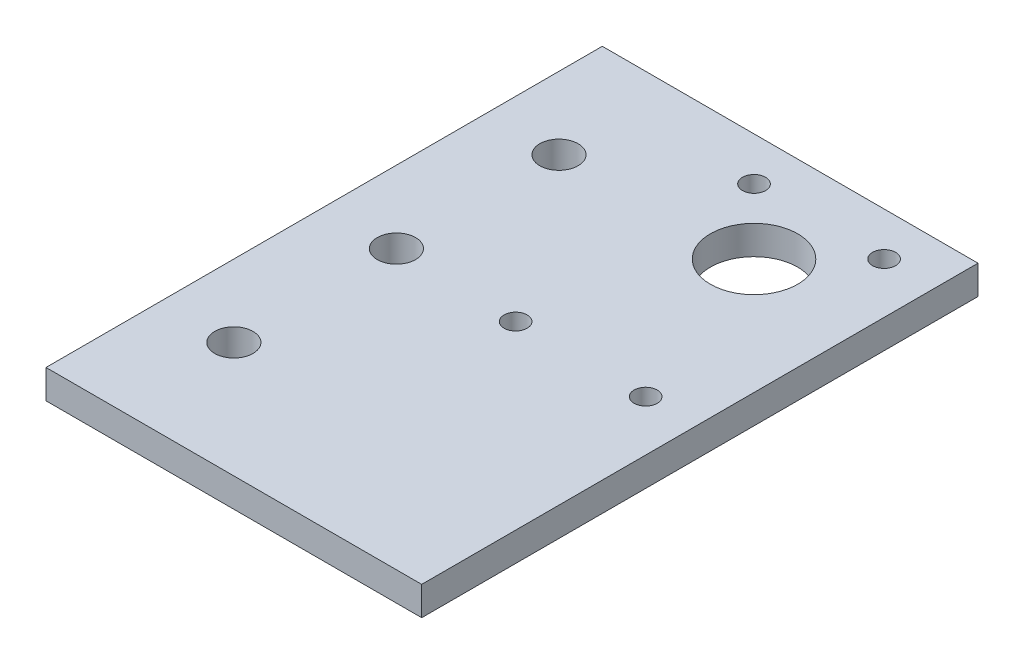
ISO-10303-21;
HEADER;
FILE_DESCRIPTION(('STEP AP214'),'2;1');
FILE_NAME('part.step','',(''),(''),'','','');
FILE_SCHEMA(('AUTOMOTIVE_DESIGN { 1 0 10303 214 1 1 1 1 }'));
ENDSEC;
DATA;
#1=APPLICATION_CONTEXT('core data for automotive mechanical design processes');
#2=APPLICATION_PROTOCOL_DEFINITION('international standard','automotive_design',2000,#1);
#3=PRODUCT_CONTEXT('',#1,'mechanical');
#4=PRODUCT('Part','Part','',(#3));
#5=PRODUCT_RELATED_PRODUCT_CATEGORY('part','',(#4));
#6=PRODUCT_DEFINITION_FORMATION('','',#4);
#7=PRODUCT_DEFINITION_CONTEXT('part definition',#1,'design');
#8=PRODUCT_DEFINITION('design','',#6,#7);
#9=PRODUCT_DEFINITION_SHAPE('','',#8);
#10=(LENGTH_UNIT() NAMED_UNIT(*) SI_UNIT(.MILLI.,.METRE.));
#11=(NAMED_UNIT(*) PLANE_ANGLE_UNIT() SI_UNIT($,.RADIAN.));
#12=(NAMED_UNIT(*) SI_UNIT($,.STERADIAN.) SOLID_ANGLE_UNIT());
#13=UNCERTAINTY_MEASURE_WITH_UNIT(LENGTH_MEASURE(1.E-05),#10,'distance_accuracy_value','');
#14=(GEOMETRIC_REPRESENTATION_CONTEXT(3) GLOBAL_UNCERTAINTY_ASSIGNED_CONTEXT((#13)) GLOBAL_UNIT_ASSIGNED_CONTEXT((#10,
#11,#12)) REPRESENTATION_CONTEXT('',''));
#15=CARTESIAN_POINT('',(0.,0.,0.));
#16=DIRECTION('',(0.,0.,1.));
#17=DIRECTION('',(1.,0.,0.));
#18=AXIS2_PLACEMENT_3D('',#15,#16,#17);
#19=CARTESIAN_POINT('',(52.,4.,0.));
#20=DIRECTION('',(1.,0.,0.));
#21=DIRECTION('',(0.,0.,-1.));
#22=AXIS2_PLACEMENT_3D('',#19,#20,#21);
#23=PLANE('',#22);
#24=DIRECTION('',(0.,0.,1.));
#25=VECTOR('',#24,1.);
#26=CARTESIAN_POINT('',(52.,0.,0.));
#27=LINE('',#26,#25);
#28=CARTESIAN_POINT('',(52.,0.,0.));
#29=VERTEX_POINT('',#28);
#30=CARTESIAN_POINT('',(52.,0.,77.));
#31=VERTEX_POINT('',#30);
#32=EDGE_CURVE('E147',#29,#31,#27,.T.);
#33=ORIENTED_EDGE('',*,*,#32,.F.);
#34=DIRECTION('',(0.,-1.,0.));
#35=VECTOR('',#34,1.);
#36=CARTESIAN_POINT('',(52.,4.,0.));
#37=LINE('',#36,#35);
#38=CARTESIAN_POINT('',(52.,4.,0.));
#39=VERTEX_POINT('',#38);
#40=EDGE_CURVE('E11',#39,#29,#37,.T.);
#41=ORIENTED_EDGE('',*,*,#40,.F.);
#42=DIRECTION('',(0.,0.,1.));
#43=VECTOR('',#42,1.);
#44=CARTESIAN_POINT('',(52.,4.,0.));
#45=LINE('',#44,#43);
#46=CARTESIAN_POINT('',(52.,4.,77.));
#47=VERTEX_POINT('',#46);
#48=EDGE_CURVE('E105',#39,#47,#45,.T.);
#49=ORIENTED_EDGE('',*,*,#48,.T.);
#50=DIRECTION('',(0.,-1.,0.));
#51=VECTOR('',#50,1.);
#52=CARTESIAN_POINT('',(52.,4.,77.));
#53=LINE('',#52,#51);
#54=EDGE_CURVE('E82',#47,#31,#53,.T.);
#55=ORIENTED_EDGE('',*,*,#54,.T.);
#56=EDGE_LOOP('',(#33,#41,#49,#55));
#57=FACE_BOUND('',#56,.T.);
#58=ADVANCED_FACE('F41',(#57),#23,.T.);
#59=CARTESIAN_POINT('',(0.,4.,0.));
#60=DIRECTION('',(0.,0.,-1.));
#61=DIRECTION('',(-1.,0.,0.));
#62=AXIS2_PLACEMENT_3D('',#59,#60,#61);
#63=PLANE('',#62);
#64=DIRECTION('',(1.,0.,0.));
#65=VECTOR('',#64,1.);
#66=CARTESIAN_POINT('',(0.,0.,0.));
#67=LINE('',#66,#65);
#68=CARTESIAN_POINT('',(0.,0.,0.));
#69=VERTEX_POINT('',#68);
#70=EDGE_CURVE('E94',#69,#29,#67,.T.);
#71=ORIENTED_EDGE('',*,*,#70,.F.);
#72=DIRECTION('',(0.,-1.,0.));
#73=VECTOR('',#72,1.);
#74=CARTESIAN_POINT('',(0.,4.,0.));
#75=LINE('',#74,#73);
#76=CARTESIAN_POINT('',(0.,4.,0.));
#77=VERTEX_POINT('',#76);
#78=EDGE_CURVE('E51',#77,#69,#75,.T.);
#79=ORIENTED_EDGE('',*,*,#78,.F.);
#80=DIRECTION('',(1.,0.,0.));
#81=VECTOR('',#80,1.);
#82=CARTESIAN_POINT('',(0.,4.,0.));
#83=LINE('',#82,#81);
#84=EDGE_CURVE('E92',#77,#39,#83,.T.);
#85=ORIENTED_EDGE('',*,*,#84,.T.);
#86=ORIENTED_EDGE('',*,*,#40,.T.);
#87=EDGE_LOOP('',(#71,#79,#85,#86));
#88=FACE_BOUND('',#87,.T.);
#89=ADVANCED_FACE('F90',(#88),#63,.T.);
#90=CARTESIAN_POINT('',(0.,4.,0.));
#91=DIRECTION('',(1.,0.,0.));
#92=DIRECTION('',(0.,0.,-1.));
#93=AXIS2_PLACEMENT_3D('',#90,#91,#92);
#94=PLANE('',#93);
#95=DIRECTION('',(0.,0.,1.));
#96=VECTOR('',#95,1.);
#97=CARTESIAN_POINT('',(0.,0.,0.));
#98=LINE('',#97,#96);
#99=CARTESIAN_POINT('',(0.,0.,77.));
#100=VERTEX_POINT('',#99);
#101=EDGE_CURVE('E152',#69,#100,#98,.T.);
#102=ORIENTED_EDGE('',*,*,#101,.T.);
#103=DIRECTION('',(0.,-1.,0.));
#104=VECTOR('',#103,1.);
#105=CARTESIAN_POINT('',(0.,4.,77.));
#106=LINE('',#105,#104);
#107=CARTESIAN_POINT('',(0.,4.,77.));
#108=VERTEX_POINT('',#107);
#109=EDGE_CURVE('E98',#108,#100,#106,.T.);
#110=ORIENTED_EDGE('',*,*,#109,.F.);
#111=DIRECTION('',(0.,0.,1.));
#112=VECTOR('',#111,1.);
#113=CARTESIAN_POINT('',(0.,4.,0.));
#114=LINE('',#113,#112);
#115=EDGE_CURVE('E100',#77,#108,#114,.T.);
#116=ORIENTED_EDGE('',*,*,#115,.F.);
#117=ORIENTED_EDGE('',*,*,#78,.T.);
#118=EDGE_LOOP('',(#102,#110,#116,#117));
#119=FACE_BOUND('',#118,.T.);
#120=ADVANCED_FACE('F101',(#119),#94,.F.);
#121=CARTESIAN_POINT('',(27.,4.,6.));
#122=DIRECTION('',(0.,-1.,0.));
#123=DIRECTION('',(0.,0.,-1.));
#124=AXIS2_PLACEMENT_3D('',#121,#122,#123);
#125=CYLINDRICAL_SURFACE('',#124,1.6);
#126=CARTESIAN_POINT('',(27.,4.,6.));
#127=DIRECTION('',(0.,1.,0.));
#128=DIRECTION('',(0.,0.,1.));
#129=AXIS2_PLACEMENT_3D('',#126,#127,#128);
#130=CIRCLE('',#129,1.6);
#131=CARTESIAN_POINT('',(27.,4.,7.6));
#132=VERTEX_POINT('',#131);
#133=EDGE_CURVE('E109',#132,#132,#130,.T.);
#134=ORIENTED_EDGE('',*,*,#133,.T.);
#135=EDGE_LOOP('',(#134));
#136=FACE_BOUND('',#135,.T.);
#137=CARTESIAN_POINT('',(27.,0.,6.));
#138=DIRECTION('',(0.,1.,0.));
#139=DIRECTION('',(0.,0.,1.));
#140=AXIS2_PLACEMENT_3D('',#137,#138,#139);
#141=CIRCLE('',#140,1.6);
#142=CARTESIAN_POINT('',(27.,0.,7.6));
#143=VERTEX_POINT('',#142);
#144=EDGE_CURVE('E143',#143,#143,#141,.T.);
#145=ORIENTED_EDGE('',*,*,#144,.F.);
#146=EDGE_LOOP('',(#145));
#147=FACE_BOUND('',#146,.T.);
#148=ADVANCED_FACE('F172',(#136,#147),#125,.F.);
#149=CARTESIAN_POINT('',(45.,4.,6.));
#150=DIRECTION('',(0.,-1.,0.));
#151=DIRECTION('',(0.,0.,-1.));
#152=AXIS2_PLACEMENT_3D('',#149,#150,#151);
#153=CYLINDRICAL_SURFACE('',#152,1.6);
#154=CARTESIAN_POINT('',(45.,4.,6.));
#155=DIRECTION('',(0.,1.,0.));
#156=DIRECTION('',(0.,0.,1.));
#157=AXIS2_PLACEMENT_3D('',#154,#155,#156);
#158=CIRCLE('',#157,1.6);
#159=CARTESIAN_POINT('',(45.,4.,7.6));
#160=VERTEX_POINT('',#159);
#161=EDGE_CURVE('E340',#160,#160,#158,.T.);
#162=ORIENTED_EDGE('',*,*,#161,.T.);
#163=EDGE_LOOP('',(#162));
#164=FACE_BOUND('',#163,.T.);
#165=CARTESIAN_POINT('',(45.,0.,6.));
#166=DIRECTION('',(0.,1.,0.));
#167=DIRECTION('',(0.,0.,1.));
#168=AXIS2_PLACEMENT_3D('',#165,#166,#167);
#169=CIRCLE('',#168,1.6);
#170=CARTESIAN_POINT('',(45.,0.,7.6));
#171=VERTEX_POINT('',#170);
#172=EDGE_CURVE('E139',#171,#171,#169,.T.);
#173=ORIENTED_EDGE('',*,*,#172,.F.);
#174=EDGE_LOOP('',(#173));
#175=FACE_BOUND('',#174,.T.);
#176=ADVANCED_FACE('F175',(#164,#175),#153,.F.);
#177=CARTESIAN_POINT('',(45.,4.,39.));
#178=DIRECTION('',(0.,-1.,0.));
#179=DIRECTION('',(0.,0.,-1.));
#180=AXIS2_PLACEMENT_3D('',#177,#178,#179);
#181=CYLINDRICAL_SURFACE('',#180,1.6);
#182=CARTESIAN_POINT('',(45.,4.,39.));
#183=DIRECTION('',(0.,1.,0.));
#184=DIRECTION('',(0.,0.,1.));
#185=AXIS2_PLACEMENT_3D('',#182,#183,#184);
#186=CIRCLE('',#185,1.6);
#187=CARTESIAN_POINT('',(45.,4.,40.6));
#188=VERTEX_POINT('',#187);
#189=EDGE_CURVE('E336',#188,#188,#186,.T.);
#190=ORIENTED_EDGE('',*,*,#189,.T.);
#191=EDGE_LOOP('',(#190));
#192=FACE_BOUND('',#191,.T.);
#193=CARTESIAN_POINT('',(45.,0.,39.));
#194=DIRECTION('',(0.,1.,0.));
#195=DIRECTION('',(0.,0.,1.));
#196=AXIS2_PLACEMENT_3D('',#193,#194,#195);
#197=CIRCLE('',#196,1.6);
#198=CARTESIAN_POINT('',(45.,0.,40.6));
#199=VERTEX_POINT('',#198);
#200=EDGE_CURVE('E135',#199,#199,#197,.T.);
#201=ORIENTED_EDGE('',*,*,#200,.F.);
#202=EDGE_LOOP('',(#201));
#203=FACE_BOUND('',#202,.T.);
#204=ADVANCED_FACE('F179',(#192,#203),#181,.F.);
#205=CARTESIAN_POINT('',(27.,4.,39.));
#206=DIRECTION('',(0.,-1.,0.));
#207=DIRECTION('',(0.,0.,-1.));
#208=AXIS2_PLACEMENT_3D('',#205,#206,#207);
#209=CYLINDRICAL_SURFACE('',#208,1.6);
#210=CARTESIAN_POINT('',(27.,4.,39.));
#211=DIRECTION('',(0.,1.,0.));
#212=DIRECTION('',(0.,0.,1.));
#213=AXIS2_PLACEMENT_3D('',#210,#211,#212);
#214=CIRCLE('',#213,1.6);
#215=CARTESIAN_POINT('',(27.,4.,40.6));
#216=VERTEX_POINT('',#215);
#217=EDGE_CURVE('E332',#216,#216,#214,.T.);
#218=ORIENTED_EDGE('',*,*,#217,.T.);
#219=EDGE_LOOP('',(#218));
#220=FACE_BOUND('',#219,.T.);
#221=CARTESIAN_POINT('',(27.,0.,39.));
#222=DIRECTION('',(0.,1.,0.));
#223=DIRECTION('',(0.,0.,1.));
#224=AXIS2_PLACEMENT_3D('',#221,#222,#223);
#225=CIRCLE('',#224,1.6);
#226=CARTESIAN_POINT('',(27.,0.,40.6));
#227=VERTEX_POINT('',#226);
#228=EDGE_CURVE('E131',#227,#227,#225,.T.);
#229=ORIENTED_EDGE('',*,*,#228,.F.);
#230=EDGE_LOOP('',(#229));
#231=FACE_BOUND('',#230,.T.);
#232=ADVANCED_FACE('F183',(#220,#231),#209,.F.);
#233=CARTESIAN_POINT('',(9.99999999999999,4.,16.));
#234=DIRECTION('',(0.,-1.,0.));
#235=DIRECTION('',(0.,0.,-1.));
#236=AXIS2_PLACEMENT_3D('',#233,#234,#235);
#237=CYLINDRICAL_SURFACE('',#236,2.65);
#238=CARTESIAN_POINT('',(9.99999999999999,4.,16.));
#239=DIRECTION('',(0.,1.,0.));
#240=DIRECTION('',(0.,0.,1.));
#241=AXIS2_PLACEMENT_3D('',#238,#239,#240);
#242=CIRCLE('',#241,2.65);
#243=CARTESIAN_POINT('',(9.99999999999999,4.,18.65));
#244=VERTEX_POINT('',#243);
#245=EDGE_CURVE('E328',#244,#244,#242,.T.);
#246=ORIENTED_EDGE('',*,*,#245,.T.);
#247=EDGE_LOOP('',(#246));
#248=FACE_BOUND('',#247,.T.);
#249=CARTESIAN_POINT('',(9.99999999999999,0.,16.));
#250=DIRECTION('',(0.,1.,0.));
#251=DIRECTION('',(0.,0.,1.));
#252=AXIS2_PLACEMENT_3D('',#249,#250,#251);
#253=CIRCLE('',#252,2.65);
#254=CARTESIAN_POINT('',(9.99999999999999,0.,18.65));
#255=VERTEX_POINT('',#254);
#256=EDGE_CURVE('E127',#255,#255,#253,.T.);
#257=ORIENTED_EDGE('',*,*,#256,.F.);
#258=EDGE_LOOP('',(#257));
#259=FACE_BOUND('',#258,.T.);
#260=ADVANCED_FACE('F187',(#248,#259),#237,.F.);
#261=CARTESIAN_POINT('',(36.,4.,15.));
#262=DIRECTION('',(0.,-1.,0.));
#263=DIRECTION('',(0.,0.,-1.));
#264=AXIS2_PLACEMENT_3D('',#261,#262,#263);
#265=CYLINDRICAL_SURFACE('',#264,6.05);
#266=CARTESIAN_POINT('',(36.,4.,15.));
#267=DIRECTION('',(0.,1.,0.));
#268=DIRECTION('',(0.,0.,1.));
#269=AXIS2_PLACEMENT_3D('',#266,#267,#268);
#270=CIRCLE('',#269,6.05);
#271=CARTESIAN_POINT('',(36.,4.,21.05));
#272=VERTEX_POINT('',#271);
#273=EDGE_CURVE('E324',#272,#272,#270,.T.);
#274=ORIENTED_EDGE('',*,*,#273,.T.);
#275=EDGE_LOOP('',(#274));
#276=FACE_BOUND('',#275,.T.);
#277=CARTESIAN_POINT('',(36.,0.,15.));
#278=DIRECTION('',(0.,1.,0.));
#279=DIRECTION('',(0.,0.,1.));
#280=AXIS2_PLACEMENT_3D('',#277,#278,#279);
#281=CIRCLE('',#280,6.05);
#282=CARTESIAN_POINT('',(36.,0.,21.05));
#283=VERTEX_POINT('',#282);
#284=EDGE_CURVE('E123',#283,#283,#281,.T.);
#285=ORIENTED_EDGE('',*,*,#284,.F.);
#286=EDGE_LOOP('',(#285));
#287=FACE_BOUND('',#286,.T.);
#288=ADVANCED_FACE('F191',(#276,#287),#265,.F.);
#289=CARTESIAN_POINT('',(10.,4.,38.5));
#290=DIRECTION('',(0.,-1.,0.));
#291=DIRECTION('',(0.,0.,-1.));
#292=AXIS2_PLACEMENT_3D('',#289,#290,#291);
#293=CYLINDRICAL_SURFACE('',#292,2.65);
#294=CARTESIAN_POINT('',(10.,4.,38.5));
#295=DIRECTION('',(0.,1.,0.));
#296=DIRECTION('',(0.,0.,1.));
#297=AXIS2_PLACEMENT_3D('',#294,#295,#296);
#298=CIRCLE('',#297,2.65);
#299=CARTESIAN_POINT('',(10.,4.,41.15));
#300=VERTEX_POINT('',#299);
#301=EDGE_CURVE('E205',#300,#300,#298,.T.);
#302=ORIENTED_EDGE('',*,*,#301,.T.);
#303=EDGE_LOOP('',(#302));
#304=FACE_BOUND('',#303,.T.);
#305=CARTESIAN_POINT('',(10.,0.,38.5));
#306=DIRECTION('',(0.,1.,0.));
#307=DIRECTION('',(0.,0.,1.));
#308=AXIS2_PLACEMENT_3D('',#305,#306,#307);
#309=CIRCLE('',#308,2.65);
#310=CARTESIAN_POINT('',(10.,0.,41.15));
#311=VERTEX_POINT('',#310);
#312=EDGE_CURVE('E119',#311,#311,#309,.T.);
#313=ORIENTED_EDGE('',*,*,#312,.F.);
#314=EDGE_LOOP('',(#313));
#315=FACE_BOUND('',#314,.T.);
#316=ADVANCED_FACE('F194',(#304,#315),#293,.F.);
#317=CARTESIAN_POINT('',(10.,4.,61.));
#318=DIRECTION('',(0.,-1.,0.));
#319=DIRECTION('',(0.,0.,-1.));
#320=AXIS2_PLACEMENT_3D('',#317,#318,#319);
#321=CYLINDRICAL_SURFACE('',#320,2.65);
#322=CARTESIAN_POINT('',(10.,4.,61.));
#323=DIRECTION('',(0.,1.,0.));
#324=DIRECTION('',(0.,0.,1.));
#325=AXIS2_PLACEMENT_3D('',#322,#323,#324);
#326=CIRCLE('',#325,2.65);
#327=CARTESIAN_POINT('',(10.,4.,63.65));
#328=VERTEX_POINT('',#327);
#329=EDGE_CURVE('E157',#328,#328,#326,.T.);
#330=ORIENTED_EDGE('',*,*,#329,.T.);
#331=EDGE_LOOP('',(#330));
#332=FACE_BOUND('',#331,.T.);
#333=CARTESIAN_POINT('',(10.,0.,61.));
#334=DIRECTION('',(0.,1.,0.));
#335=DIRECTION('',(0.,0.,1.));
#336=AXIS2_PLACEMENT_3D('',#333,#334,#335);
#337=CIRCLE('',#336,2.65);
#338=CARTESIAN_POINT('',(10.,0.,63.65));
#339=VERTEX_POINT('',#338);
#340=EDGE_CURVE('E115',#339,#339,#337,.T.);
#341=ORIENTED_EDGE('',*,*,#340,.F.);
#342=EDGE_LOOP('',(#341));
#343=FACE_BOUND('',#342,.T.);
#344=ADVANCED_FACE('F43',(#332,#343),#321,.F.);
#345=CARTESIAN_POINT('',(0.,4.,77.));
#346=DIRECTION('',(0.,0.,-1.));
#347=DIRECTION('',(-1.,0.,0.));
#348=AXIS2_PLACEMENT_3D('',#345,#346,#347);
#349=PLANE('',#348);
#350=DIRECTION('',(1.,0.,0.));
#351=VECTOR('',#350,1.);
#352=CARTESIAN_POINT('',(0.,0.,77.));
#353=LINE('',#352,#351);
#354=EDGE_CURVE('E75',#100,#31,#353,.T.);
#355=ORIENTED_EDGE('',*,*,#354,.T.);
#356=ORIENTED_EDGE('',*,*,#54,.F.);
#357=DIRECTION('',(1.,0.,0.));
#358=VECTOR('',#357,1.);
#359=CARTESIAN_POINT('',(0.,4.,77.));
#360=LINE('',#359,#358);
#361=EDGE_CURVE('E59',#108,#47,#360,.T.);
#362=ORIENTED_EDGE('',*,*,#361,.F.);
#363=ORIENTED_EDGE('',*,*,#109,.T.);
#364=EDGE_LOOP('',(#355,#356,#362,#363));
#365=FACE_BOUND('',#364,.T.);
#366=ADVANCED_FACE('F162',(#365),#349,.F.);
#367=CARTESIAN_POINT('',(0.,4.,0.));
#368=DIRECTION('',(0.,1.,0.));
#369=DIRECTION('',(0.,0.,1.));
#370=AXIS2_PLACEMENT_3D('',#367,#368,#369);
#371=PLANE('',#370);
#372=ORIENTED_EDGE('',*,*,#329,.F.);
#373=EDGE_LOOP('',(#372));
#374=FACE_BOUND('',#373,.T.);
#375=ORIENTED_EDGE('',*,*,#301,.F.);
#376=EDGE_LOOP('',(#375));
#377=FACE_BOUND('',#376,.T.);
#378=ORIENTED_EDGE('',*,*,#273,.F.);
#379=EDGE_LOOP('',(#378));
#380=FACE_BOUND('',#379,.T.);
#381=ORIENTED_EDGE('',*,*,#245,.F.);
#382=EDGE_LOOP('',(#381));
#383=FACE_BOUND('',#382,.T.);
#384=ORIENTED_EDGE('',*,*,#217,.F.);
#385=EDGE_LOOP('',(#384));
#386=FACE_BOUND('',#385,.T.);
#387=ORIENTED_EDGE('',*,*,#189,.F.);
#388=EDGE_LOOP('',(#387));
#389=FACE_BOUND('',#388,.T.);
#390=ORIENTED_EDGE('',*,*,#161,.F.);
#391=EDGE_LOOP('',(#390));
#392=FACE_BOUND('',#391,.T.);
#393=ORIENTED_EDGE('',*,*,#133,.F.);
#394=EDGE_LOOP('',(#393));
#395=FACE_BOUND('',#394,.T.);
#396=ORIENTED_EDGE('',*,*,#48,.F.);
#397=ORIENTED_EDGE('',*,*,#84,.F.);
#398=ORIENTED_EDGE('',*,*,#115,.T.);
#399=ORIENTED_EDGE('',*,*,#361,.T.);
#400=EDGE_LOOP('',(#396,#397,#398,#399));
#401=FACE_BOUND('',#400,.T.);
#402=ADVANCED_FACE('F104',(#374,#377,#380,#383,#386,#389,#392,#395,#401),#371,.T.);
#403=CARTESIAN_POINT('',(0.,0.,0.));
#404=DIRECTION('',(0.,1.,0.));
#405=DIRECTION('',(0.,0.,1.));
#406=AXIS2_PLACEMENT_3D('',#403,#404,#405);
#407=PLANE('',#406);
#408=ORIENTED_EDGE('',*,*,#340,.T.);
#409=EDGE_LOOP('',(#408));
#410=FACE_BOUND('',#409,.T.);
#411=ORIENTED_EDGE('',*,*,#312,.T.);
#412=EDGE_LOOP('',(#411));
#413=FACE_BOUND('',#412,.T.);
#414=ORIENTED_EDGE('',*,*,#284,.T.);
#415=EDGE_LOOP('',(#414));
#416=FACE_BOUND('',#415,.T.);
#417=ORIENTED_EDGE('',*,*,#256,.T.);
#418=EDGE_LOOP('',(#417));
#419=FACE_BOUND('',#418,.T.);
#420=ORIENTED_EDGE('',*,*,#228,.T.);
#421=EDGE_LOOP('',(#420));
#422=FACE_BOUND('',#421,.T.);
#423=ORIENTED_EDGE('',*,*,#200,.T.);
#424=EDGE_LOOP('',(#423));
#425=FACE_BOUND('',#424,.T.);
#426=ORIENTED_EDGE('',*,*,#172,.T.);
#427=EDGE_LOOP('',(#426));
#428=FACE_BOUND('',#427,.T.);
#429=ORIENTED_EDGE('',*,*,#144,.T.);
#430=EDGE_LOOP('',(#429));
#431=FACE_BOUND('',#430,.T.);
#432=ORIENTED_EDGE('',*,*,#32,.T.);
#433=ORIENTED_EDGE('',*,*,#354,.F.);
#434=ORIENTED_EDGE('',*,*,#101,.F.);
#435=ORIENTED_EDGE('',*,*,#70,.T.);
#436=EDGE_LOOP('',(#432,#433,#434,#435));
#437=FACE_BOUND('',#436,.T.);
#438=ADVANCED_FACE('F163',(#410,#413,#416,#419,#422,#425,#428,#431,#437),#407,.F.);
#439=CLOSED_SHELL('',(#58,#89,#120,#148,#176,#204,#232,#260,#288,#316,#344,#366,#402,#438));
#440=MANIFOLD_SOLID_BREP('B2',#439);
#441=ADVANCED_BREP_SHAPE_REPRESENTATION('',(#18,#440),#14);
#442=SHAPE_DEFINITION_REPRESENTATION(#9,#441);
ENDSEC;
END-ISO-10303-21;
